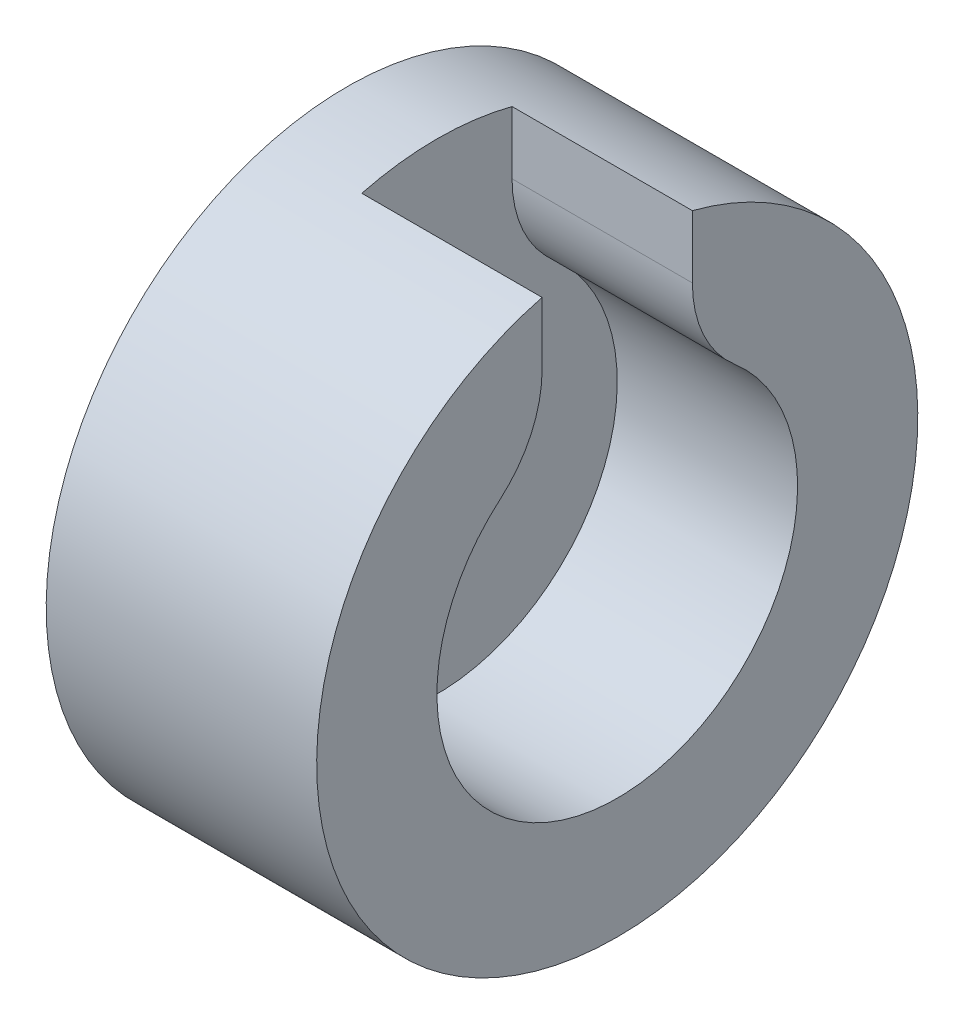
ISO-10303-21;
HEADER;
FILE_DESCRIPTION(('STEP AP214'),'2;1');
FILE_NAME('part.step','',(''),(''),'','','');
FILE_SCHEMA(('AUTOMOTIVE_DESIGN { 1 0 10303 214 1 1 1 1 }'));
ENDSEC;
DATA;
#1=APPLICATION_CONTEXT('core data for automotive mechanical design processes');
#2=APPLICATION_PROTOCOL_DEFINITION('international standard','automotive_design',2000,#1);
#3=PRODUCT_CONTEXT('',#1,'mechanical');
#4=PRODUCT('Part','Part','',(#3));
#5=PRODUCT_RELATED_PRODUCT_CATEGORY('part','',(#4));
#6=PRODUCT_DEFINITION_FORMATION('','',#4);
#7=PRODUCT_DEFINITION_CONTEXT('part definition',#1,'design');
#8=PRODUCT_DEFINITION('design','',#6,#7);
#9=PRODUCT_DEFINITION_SHAPE('','',#8);
#10=(LENGTH_UNIT() NAMED_UNIT(*) SI_UNIT(.MILLI.,.METRE.));
#11=(NAMED_UNIT(*) PLANE_ANGLE_UNIT() SI_UNIT($,.RADIAN.));
#12=(NAMED_UNIT(*) SI_UNIT($,.STERADIAN.) SOLID_ANGLE_UNIT());
#13=UNCERTAINTY_MEASURE_WITH_UNIT(LENGTH_MEASURE(1.E-05),#10,'distance_accuracy_value','');
#14=(GEOMETRIC_REPRESENTATION_CONTEXT(3) GLOBAL_UNCERTAINTY_ASSIGNED_CONTEXT((#13)) GLOBAL_UNIT_ASSIGNED_CONTEXT((#10,
#11,#12)) REPRESENTATION_CONTEXT('',''));
#15=CARTESIAN_POINT('',(0.,0.,0.));
#16=DIRECTION('',(0.,0.,1.));
#17=DIRECTION('',(1.,0.,0.));
#18=AXIS2_PLACEMENT_3D('',#15,#16,#17);
#19=CARTESIAN_POINT('',(1.5,0.,0.));
#20=DIRECTION('',(-1.,0.,0.));
#21=DIRECTION('',(0.,0.,1.));
#22=AXIS2_PLACEMENT_3D('',#19,#20,#21);
#23=CYLINDRICAL_SURFACE('',#22,5.);
#24=CARTESIAN_POINT('',(0.,0.,0.));
#25=DIRECTION('',(1.,0.,0.));
#26=DIRECTION('',(0.,0.,-1.));
#27=AXIS2_PLACEMENT_3D('',#24,#25,#26);
#28=CIRCLE('',#27,5.);
#29=CARTESIAN_POINT('',(0.,0.,-5.));
#30=VERTEX_POINT('',#29);
#31=EDGE_CURVE('E131',#30,#30,#28,.T.);
#32=ORIENTED_EDGE('',*,*,#31,.T.);
#33=EDGE_LOOP('',(#32));
#34=FACE_BOUND('',#33,.T.);
#35=CARTESIAN_POINT('',(4.5,0.,0.));
#36=DIRECTION('',(1.,0.,0.));
#37=DIRECTION('',(0.,0.,-1.));
#38=AXIS2_PLACEMENT_3D('',#35,#36,#37);
#39=CIRCLE('',#38,5.);
#40=CARTESIAN_POINT('',(4.5,4.84122918275927,1.25));
#41=VERTEX_POINT('',#40);
#42=CARTESIAN_POINT('',(4.5,4.84122918275927,-1.25));
#43=VERTEX_POINT('',#42);
#44=EDGE_CURVE('E125',#41,#43,#39,.T.);
#45=ORIENTED_EDGE('',*,*,#44,.F.);
#46=DIRECTION('',(-1.,0.,0.));
#47=VECTOR('',#46,1.);
#48=CARTESIAN_POINT('',(1.5,4.84122918275927,1.25));
#49=LINE('',#48,#47);
#50=CARTESIAN_POINT('',(1.5,4.84122918275927,1.25));
#51=VERTEX_POINT('',#50);
#52=EDGE_CURVE('E116',#41,#51,#49,.T.);
#53=ORIENTED_EDGE('',*,*,#52,.T.);
#54=CARTESIAN_POINT('',(1.5,0.,0.));
#55=DIRECTION('',(1.,0.,0.));
#56=DIRECTION('',(0.,0.,-1.));
#57=AXIS2_PLACEMENT_3D('',#54,#55,#56);
#58=CIRCLE('',#57,5.);
#59=CARTESIAN_POINT('',(1.5,4.84122918275927,-1.25));
#60=VERTEX_POINT('',#59);
#61=EDGE_CURVE('E99',#60,#51,#58,.T.);
#62=ORIENTED_EDGE('',*,*,#61,.F.);
#63=DIRECTION('',(-1.,0.,0.));
#64=VECTOR('',#63,1.);
#65=CARTESIAN_POINT('',(1.5,4.84122918275927,-1.25));
#66=LINE('',#65,#64);
#67=EDGE_CURVE('E108',#43,#60,#66,.T.);
#68=ORIENTED_EDGE('',*,*,#67,.F.);
#69=EDGE_LOOP('',(#45,#53,#62,#68));
#70=FACE_BOUND('',#69,.T.);
#71=ADVANCED_FACE('F39',(#34,#70),#23,.T.);
#72=CARTESIAN_POINT('',(0.,0.,0.));
#73=DIRECTION('',(1.,0.,0.));
#74=DIRECTION('',(0.,0.,-1.));
#75=AXIS2_PLACEMENT_3D('',#72,#73,#74);
#76=PLANE('',#75);
#77=ORIENTED_EDGE('',*,*,#31,.F.);
#78=EDGE_LOOP('',(#77));
#79=FACE_BOUND('',#78,.T.);
#80=ADVANCED_FACE('F177',(#79),#76,.F.);
#81=CARTESIAN_POINT('',(4.5,0.,0.));
#82=DIRECTION('',(1.,0.,0.));
#83=DIRECTION('',(0.,0.,-1.));
#84=AXIS2_PLACEMENT_3D('',#81,#82,#83);
#85=PLANE('',#84);
#86=DIRECTION('',(0.,1.,0.));
#87=VECTOR('',#86,1.);
#88=CARTESIAN_POINT('',(4.5,0.,-1.25));
#89=LINE('',#88,#87);
#90=CARTESIAN_POINT('',(4.5,3.79967103839267,-1.25));
#91=VERTEX_POINT('',#90);
#92=EDGE_CURVE('E111',#91,#43,#89,.T.);
#93=ORIENTED_EDGE('',*,*,#92,.F.);
#94=CARTESIAN_POINT('',(4.5,3.79967103839267,-3.25));
#95=DIRECTION('',(1.,0.,0.));
#96=DIRECTION('',(0.,0.,-1.));
#97=AXIS2_PLACEMENT_3D('',#94,#95,#96);
#98=CIRCLE('',#97,2.);
#99=CARTESIAN_POINT('',(4.5,2.2798026230356,-1.95));
#100=VERTEX_POINT('',#99);
#101=EDGE_CURVE('E151',#91,#100,#98,.T.);
#102=ORIENTED_EDGE('',*,*,#101,.T.);
#103=CARTESIAN_POINT('',(4.5,0.,0.));
#104=DIRECTION('',(1.,0.,0.));
#105=DIRECTION('',(0.,0.,-1.));
#106=AXIS2_PLACEMENT_3D('',#103,#104,#105);
#107=CIRCLE('',#106,3.);
#108=CARTESIAN_POINT('',(4.5,2.2798026230356,1.95));
#109=VERTEX_POINT('',#108);
#110=EDGE_CURVE('E120',#109,#100,#107,.T.);
#111=ORIENTED_EDGE('',*,*,#110,.F.);
#112=CARTESIAN_POINT('',(4.5,3.79967103839267,3.25));
#113=DIRECTION('',(1.,0.,0.));
#114=DIRECTION('',(0.,0.,-1.));
#115=AXIS2_PLACEMENT_3D('',#112,#113,#114);
#116=CIRCLE('',#115,2.);
#117=CARTESIAN_POINT('',(4.5,3.79967103839267,1.25));
#118=VERTEX_POINT('',#117);
#119=EDGE_CURVE('E61',#109,#118,#116,.T.);
#120=ORIENTED_EDGE('',*,*,#119,.T.);
#121=DIRECTION('',(0.,1.,0.));
#122=VECTOR('',#121,1.);
#123=CARTESIAN_POINT('',(4.5,0.,1.25));
#124=LINE('',#123,#122);
#125=EDGE_CURVE('E104',#118,#41,#124,.T.);
#126=ORIENTED_EDGE('',*,*,#125,.T.);
#127=ORIENTED_EDGE('',*,*,#44,.T.);
#128=EDGE_LOOP('',(#93,#102,#111,#120,#126,#127));
#129=FACE_BOUND('',#128,.T.);
#130=ADVANCED_FACE('F165',(#129),#85,.T.);
#131=CARTESIAN_POINT('',(4.5,0.,0.));
#132=DIRECTION('',(-1.,0.,0.));
#133=DIRECTION('',(0.,0.,1.));
#134=AXIS2_PLACEMENT_3D('',#131,#132,#133);
#135=CYLINDRICAL_SURFACE('',#134,3.);
#136=ORIENTED_EDGE('',*,*,#110,.T.);
#137=DIRECTION('',(-1.,0.,0.));
#138=VECTOR('',#137,1.);
#139=CARTESIAN_POINT('',(4.5,2.2798026230356,-1.95));
#140=LINE('',#139,#138);
#141=CARTESIAN_POINT('',(1.5,2.2798026230356,-1.95));
#142=VERTEX_POINT('',#141);
#143=EDGE_CURVE('E142',#100,#142,#140,.T.);
#144=ORIENTED_EDGE('',*,*,#143,.T.);
#145=CARTESIAN_POINT('',(1.5,0.,0.));
#146=DIRECTION('',(1.,0.,0.));
#147=DIRECTION('',(0.,0.,-1.));
#148=AXIS2_PLACEMENT_3D('',#145,#146,#147);
#149=CIRCLE('',#148,3.);
#150=CARTESIAN_POINT('',(1.5,2.2798026230356,1.95));
#151=VERTEX_POINT('',#150);
#152=EDGE_CURVE('E135',#142,#151,#149,.F.);
#153=ORIENTED_EDGE('',*,*,#152,.T.);
#154=DIRECTION('',(-1.,0.,0.));
#155=VECTOR('',#154,1.);
#156=CARTESIAN_POINT('',(4.5,2.2798026230356,1.95));
#157=LINE('',#156,#155);
#158=EDGE_CURVE('E139',#151,#109,#157,.F.);
#159=ORIENTED_EDGE('',*,*,#158,.T.);
#160=EDGE_LOOP('',(#136,#144,#153,#159));
#161=FACE_BOUND('',#160,.T.);
#162=ADVANCED_FACE('F171',(#161),#135,.F.);
#163=CARTESIAN_POINT('',(1.5,0.,0.));
#164=DIRECTION('',(1.,0.,0.));
#165=DIRECTION('',(0.,0.,-1.));
#166=AXIS2_PLACEMENT_3D('',#163,#164,#165);
#167=PLANE('',#166);
#168=ORIENTED_EDGE('',*,*,#152,.F.);
#169=CARTESIAN_POINT('',(1.5,3.79967103839267,-3.25));
#170=DIRECTION('',(1.,0.,0.));
#171=DIRECTION('',(0.,0.,-1.));
#172=AXIS2_PLACEMENT_3D('',#169,#170,#171);
#173=CIRCLE('',#172,2.);
#174=CARTESIAN_POINT('',(1.5,3.79967103839267,-1.25));
#175=VERTEX_POINT('',#174);
#176=EDGE_CURVE('E48',#142,#175,#173,.F.);
#177=ORIENTED_EDGE('',*,*,#176,.T.);
#178=DIRECTION('',(0.,1.,0.));
#179=VECTOR('',#178,1.);
#180=CARTESIAN_POINT('',(1.5,0.,-1.25));
#181=LINE('',#180,#179);
#182=EDGE_CURVE('E93',#175,#60,#181,.T.);
#183=ORIENTED_EDGE('',*,*,#182,.T.);
#184=ORIENTED_EDGE('',*,*,#61,.T.);
#185=DIRECTION('',(0.,1.,0.));
#186=VECTOR('',#185,1.);
#187=CARTESIAN_POINT('',(1.5,0.,1.25));
#188=LINE('',#187,#186);
#189=CARTESIAN_POINT('',(1.5,3.79967103839267,1.25));
#190=VERTEX_POINT('',#189);
#191=EDGE_CURVE('E105',#190,#51,#188,.T.);
#192=ORIENTED_EDGE('',*,*,#191,.F.);
#193=CARTESIAN_POINT('',(1.5,3.79967103839267,3.25));
#194=DIRECTION('',(1.,0.,0.));
#195=DIRECTION('',(0.,0.,-1.));
#196=AXIS2_PLACEMENT_3D('',#193,#194,#195);
#197=CIRCLE('',#196,2.);
#198=EDGE_CURVE('E11',#190,#151,#197,.F.);
#199=ORIENTED_EDGE('',*,*,#198,.T.);
#200=EDGE_LOOP('',(#168,#177,#183,#184,#192,#199));
#201=FACE_BOUND('',#200,.T.);
#202=ADVANCED_FACE('F96',(#201),#167,.T.);
#203=CARTESIAN_POINT('',(4.5,0.,1.25));
#204=DIRECTION('',(0.,0.,1.));
#205=DIRECTION('',(1.,0.,0.));
#206=AXIS2_PLACEMENT_3D('',#203,#204,#205);
#207=PLANE('',#206);
#208=ORIENTED_EDGE('',*,*,#125,.F.);
#209=DIRECTION('',(1.,0.,0.));
#210=VECTOR('',#209,1.);
#211=CARTESIAN_POINT('',(1.5,3.79967103839267,1.25));
#212=LINE('',#211,#210);
#213=EDGE_CURVE('E154',#118,#190,#212,.F.);
#214=ORIENTED_EDGE('',*,*,#213,.T.);
#215=ORIENTED_EDGE('',*,*,#191,.T.);
#216=ORIENTED_EDGE('',*,*,#52,.F.);
#217=EDGE_LOOP('',(#208,#214,#215,#216));
#218=FACE_BOUND('',#217,.T.);
#219=ADVANCED_FACE('F158',(#218),#207,.F.);
#220=CARTESIAN_POINT('',(4.5,0.,-1.25));
#221=DIRECTION('',(0.,0.,1.));
#222=DIRECTION('',(0.,-1.,0.));
#223=AXIS2_PLACEMENT_3D('',#220,#221,#222);
#224=PLANE('',#223);
#225=ORIENTED_EDGE('',*,*,#182,.F.);
#226=DIRECTION('',(-1.,0.,0.));
#227=VECTOR('',#226,1.);
#228=CARTESIAN_POINT('',(4.5,3.79967103839267,-1.25));
#229=LINE('',#228,#227);
#230=EDGE_CURVE('E146',#175,#91,#229,.F.);
#231=ORIENTED_EDGE('',*,*,#230,.T.);
#232=ORIENTED_EDGE('',*,*,#92,.T.);
#233=ORIENTED_EDGE('',*,*,#67,.T.);
#234=EDGE_LOOP('',(#225,#231,#232,#233));
#235=FACE_BOUND('',#234,.T.);
#236=ADVANCED_FACE('F109',(#235),#224,.T.);
#237=CARTESIAN_POINT('',(4.5,3.79967103839267,-3.25));
#238=DIRECTION('',(-1.,0.,0.));
#239=DIRECTION('',(0.,0.,1.));
#240=AXIS2_PLACEMENT_3D('',#237,#238,#239);
#241=CYLINDRICAL_SURFACE('',#240,2.);
#242=ORIENTED_EDGE('',*,*,#101,.F.);
#243=ORIENTED_EDGE('',*,*,#230,.F.);
#244=ORIENTED_EDGE('',*,*,#176,.F.);
#245=ORIENTED_EDGE('',*,*,#143,.F.);
#246=EDGE_LOOP('',(#242,#243,#244,#245));
#247=FACE_BOUND('',#246,.T.);
#248=ADVANCED_FACE('F169',(#247),#241,.T.);
#249=CARTESIAN_POINT('',(4.5,3.79967103839267,3.25));
#250=DIRECTION('',(-1.,0.,0.));
#251=DIRECTION('',(0.,0.,1.));
#252=AXIS2_PLACEMENT_3D('',#249,#250,#251);
#253=CYLINDRICAL_SURFACE('',#252,2.);
#254=ORIENTED_EDGE('',*,*,#119,.F.);
#255=ORIENTED_EDGE('',*,*,#158,.F.);
#256=ORIENTED_EDGE('',*,*,#198,.F.);
#257=ORIENTED_EDGE('',*,*,#213,.F.);
#258=EDGE_LOOP('',(#254,#255,#256,#257));
#259=FACE_BOUND('',#258,.T.);
#260=ADVANCED_FACE('F41',(#259),#253,.T.);
#261=CLOSED_SHELL('',(#71,#80,#130,#162,#202,#219,#236,#248,#260));
#262=MANIFOLD_SOLID_BREP('B2',#261);
#263=ADVANCED_BREP_SHAPE_REPRESENTATION('',(#18,#262),#14);
#264=SHAPE_DEFINITION_REPRESENTATION(#9,#263);
ENDSEC;
END-ISO-10303-21;
